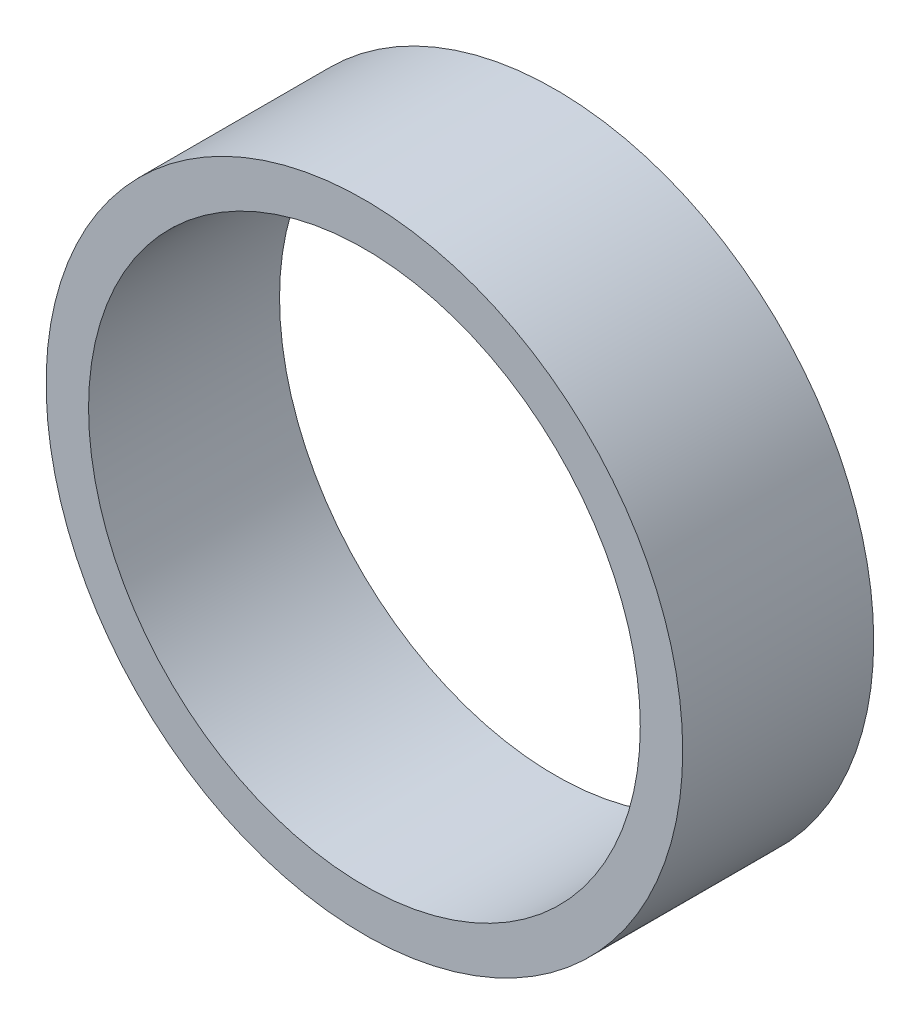
ISO-10303-21;
HEADER;
FILE_DESCRIPTION(('STEP AP214'),'2;1');
FILE_NAME('part.step','',(''),(''),'','','');
FILE_SCHEMA(('AUTOMOTIVE_DESIGN { 1 0 10303 214 1 1 1 1 }'));
ENDSEC;
DATA;
#1=APPLICATION_CONTEXT('core data for automotive mechanical design processes');
#2=APPLICATION_PROTOCOL_DEFINITION('international standard','automotive_design',2000,#1);
#3=PRODUCT_CONTEXT('',#1,'mechanical');
#4=PRODUCT('Part','Part','',(#3));
#5=PRODUCT_RELATED_PRODUCT_CATEGORY('part','',(#4));
#6=PRODUCT_DEFINITION_FORMATION('','',#4);
#7=PRODUCT_DEFINITION_CONTEXT('part definition',#1,'design');
#8=PRODUCT_DEFINITION('design','',#6,#7);
#9=PRODUCT_DEFINITION_SHAPE('','',#8);
#10=(LENGTH_UNIT() NAMED_UNIT(*) SI_UNIT(.MILLI.,.METRE.));
#11=(NAMED_UNIT(*) PLANE_ANGLE_UNIT() SI_UNIT($,.RADIAN.));
#12=(NAMED_UNIT(*) SI_UNIT($,.STERADIAN.) SOLID_ANGLE_UNIT());
#13=UNCERTAINTY_MEASURE_WITH_UNIT(LENGTH_MEASURE(1.E-05),#10,'distance_accuracy_value','');
#14=(GEOMETRIC_REPRESENTATION_CONTEXT(3) GLOBAL_UNCERTAINTY_ASSIGNED_CONTEXT((#13)) GLOBAL_UNIT_ASSIGNED_CONTEXT((#10,
#11,#12)) REPRESENTATION_CONTEXT('',''));
#15=CARTESIAN_POINT('',(0.,0.,0.));
#16=DIRECTION('',(0.,0.,1.));
#17=DIRECTION('',(1.,0.,0.));
#18=AXIS2_PLACEMENT_3D('',#15,#16,#17);
#19=CARTESIAN_POINT('',(0.,0.,22.86));
#20=DIRECTION('',(0.,0.,1.));
#21=DIRECTION('',(1.,0.,0.));
#22=AXIS2_PLACEMENT_3D('',#19,#20,#21);
#23=PLANE('',#22);
#24=CARTESIAN_POINT('',(0.,0.,22.86));
#25=DIRECTION('',(0.,0.,1.));
#26=DIRECTION('',(1.,0.,0.));
#27=AXIS2_PLACEMENT_3D('',#24,#25,#26);
#28=CIRCLE('',#27,38.1);
#29=CARTESIAN_POINT('',(38.1,0.,22.86));
#30=VERTEX_POINT('',#29);
#31=EDGE_CURVE('E10',#30,#30,#28,.T.);
#32=ORIENTED_EDGE('',*,*,#31,.T.);
#33=EDGE_LOOP('',(#32));
#34=FACE_BOUND('',#33,.T.);
#35=CARTESIAN_POINT('',(0.,0.,22.86));
#36=DIRECTION('',(0.,0.,1.));
#37=DIRECTION('',(1.,0.,0.));
#38=AXIS2_PLACEMENT_3D('',#35,#36,#37);
#39=CIRCLE('',#38,33.02);
#40=CARTESIAN_POINT('',(33.02,0.,22.86));
#41=VERTEX_POINT('',#40);
#42=EDGE_CURVE('E50',#41,#41,#39,.T.);
#43=ORIENTED_EDGE('',*,*,#42,.F.);
#44=EDGE_LOOP('',(#43));
#45=FACE_BOUND('',#44,.T.);
#46=ADVANCED_FACE('F37',(#34,#45),#23,.T.);
#47=CARTESIAN_POINT('',(0.,0.,0.));
#48=DIRECTION('',(0.,0.,1.));
#49=DIRECTION('',(1.,0.,0.));
#50=AXIS2_PLACEMENT_3D('',#47,#48,#49);
#51=PLANE('',#50);
#52=CARTESIAN_POINT('',(0.,0.,0.));
#53=DIRECTION('',(0.,0.,1.));
#54=DIRECTION('',(1.,0.,0.));
#55=AXIS2_PLACEMENT_3D('',#52,#53,#54);
#56=CIRCLE('',#55,38.1);
#57=CARTESIAN_POINT('',(38.1,0.,0.));
#58=VERTEX_POINT('',#57);
#59=EDGE_CURVE('E41',#58,#58,#56,.T.);
#60=ORIENTED_EDGE('',*,*,#59,.F.);
#61=EDGE_LOOP('',(#60));
#62=FACE_BOUND('',#61,.T.);
#63=CARTESIAN_POINT('',(0.,0.,0.));
#64=DIRECTION('',(0.,0.,1.));
#65=DIRECTION('',(1.,0.,0.));
#66=AXIS2_PLACEMENT_3D('',#63,#64,#65);
#67=CIRCLE('',#66,33.02);
#68=CARTESIAN_POINT('',(33.02,0.,0.));
#69=VERTEX_POINT('',#68);
#70=EDGE_CURVE('E52',#69,#69,#67,.T.);
#71=ORIENTED_EDGE('',*,*,#70,.T.);
#72=EDGE_LOOP('',(#71));
#73=FACE_BOUND('',#72,.T.);
#74=ADVANCED_FACE('F64',(#62,#73),#51,.F.);
#75=CARTESIAN_POINT('',(0.,0.,22.86));
#76=DIRECTION('',(0.,0.,-1.));
#77=DIRECTION('',(-1.,0.,0.));
#78=AXIS2_PLACEMENT_3D('',#75,#76,#77);
#79=CYLINDRICAL_SURFACE('',#78,38.1);
#80=ORIENTED_EDGE('',*,*,#31,.F.);
#81=EDGE_LOOP('',(#80));
#82=FACE_BOUND('',#81,.T.);
#83=ORIENTED_EDGE('',*,*,#59,.T.);
#84=EDGE_LOOP('',(#83));
#85=FACE_BOUND('',#84,.T.);
#86=ADVANCED_FACE('F39',(#82,#85),#79,.T.);
#87=CARTESIAN_POINT('',(0.,0.,22.86));
#88=DIRECTION('',(0.,0.,-1.));
#89=DIRECTION('',(-1.,0.,0.));
#90=AXIS2_PLACEMENT_3D('',#87,#88,#89);
#91=CYLINDRICAL_SURFACE('',#90,33.02);
#92=ORIENTED_EDGE('',*,*,#42,.T.);
#93=EDGE_LOOP('',(#92));
#94=FACE_BOUND('',#93,.T.);
#95=ORIENTED_EDGE('',*,*,#70,.F.);
#96=EDGE_LOOP('',(#95));
#97=FACE_BOUND('',#96,.T.);
#98=ADVANCED_FACE('F60',(#94,#97),#91,.F.);
#99=CLOSED_SHELL('',(#46,#74,#86,#98));
#100=MANIFOLD_SOLID_BREP('B2',#99);
#101=ADVANCED_BREP_SHAPE_REPRESENTATION('',(#18,#100),#14);
#102=SHAPE_DEFINITION_REPRESENTATION(#9,#101);
ENDSEC;
END-ISO-10303-21;
